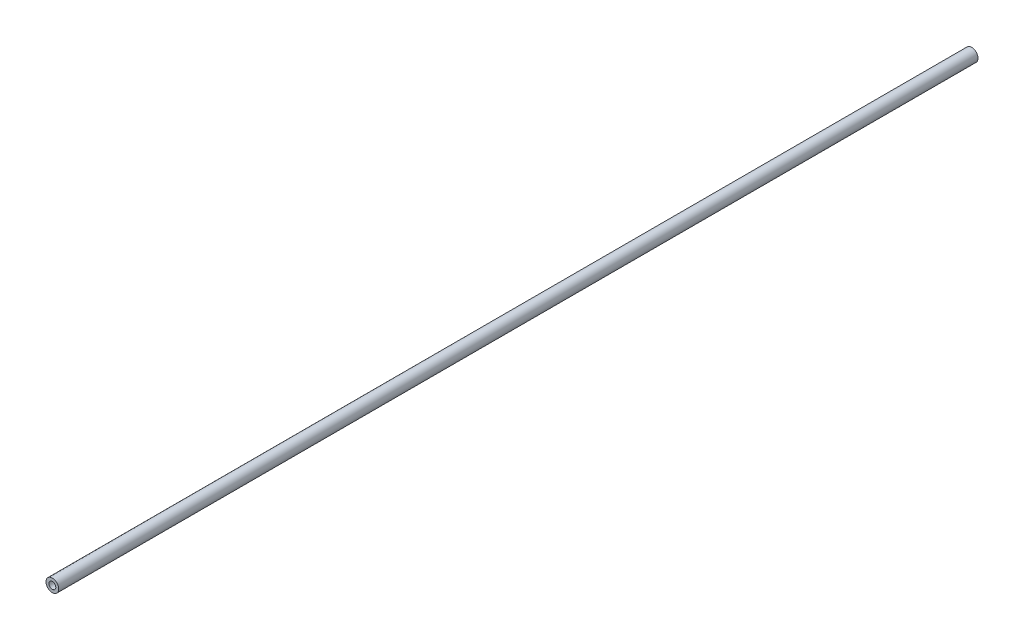
ISO-10303-21;
HEADER;
FILE_DESCRIPTION(('STEP AP214'),'2;1');
FILE_NAME('part.step','',(''),(''),'','','');
FILE_SCHEMA(('AUTOMOTIVE_DESIGN { 1 0 10303 214 1 1 1 1 }'));
ENDSEC;
DATA;
#1=APPLICATION_CONTEXT('core data for automotive mechanical design processes');
#2=APPLICATION_PROTOCOL_DEFINITION('international standard','automotive_design',2000,#1);
#3=PRODUCT_CONTEXT('',#1,'mechanical');
#4=PRODUCT('Part','Part','',(#3));
#5=PRODUCT_RELATED_PRODUCT_CATEGORY('part','',(#4));
#6=PRODUCT_DEFINITION_FORMATION('','',#4);
#7=PRODUCT_DEFINITION_CONTEXT('part definition',#1,'design');
#8=PRODUCT_DEFINITION('design','',#6,#7);
#9=PRODUCT_DEFINITION_SHAPE('','',#8);
#10=(LENGTH_UNIT() NAMED_UNIT(*) SI_UNIT(.MILLI.,.METRE.));
#11=(NAMED_UNIT(*) PLANE_ANGLE_UNIT() SI_UNIT($,.RADIAN.));
#12=(NAMED_UNIT(*) SI_UNIT($,.STERADIAN.) SOLID_ANGLE_UNIT());
#13=UNCERTAINTY_MEASURE_WITH_UNIT(LENGTH_MEASURE(1.E-05),#10,'distance_accuracy_value','');
#14=(GEOMETRIC_REPRESENTATION_CONTEXT(3) GLOBAL_UNCERTAINTY_ASSIGNED_CONTEXT((#13)) GLOBAL_UNIT_ASSIGNED_CONTEXT((#10,
#11,#12)) REPRESENTATION_CONTEXT('',''));
#15=CARTESIAN_POINT('',(0.,0.,0.));
#16=DIRECTION('',(0.,0.,1.));
#17=DIRECTION('',(1.,0.,0.));
#18=AXIS2_PLACEMENT_3D('',#15,#16,#17);
#19=CARTESIAN_POINT('',(0.,0.,322.072));
#20=DIRECTION('',(0.,0.,1.));
#21=DIRECTION('',(1.,0.,0.));
#22=AXIS2_PLACEMENT_3D('',#19,#20,#21);
#23=PLANE('',#22);
#24=CARTESIAN_POINT('',(0.,0.,322.072));
#25=DIRECTION('',(0.,0.,1.));
#26=DIRECTION('',(1.,0.,0.));
#27=AXIS2_PLACEMENT_3D('',#24,#25,#26);
#28=CIRCLE('',#27,2.2225);
#29=CARTESIAN_POINT('',(2.2225,0.,322.072));
#30=VERTEX_POINT('',#29);
#31=EDGE_CURVE('E10',#30,#30,#28,.T.);
#32=ORIENTED_EDGE('',*,*,#31,.T.);
#33=EDGE_LOOP('',(#32));
#34=FACE_BOUND('',#33,.T.);
#35=CARTESIAN_POINT('',(0.,0.,322.072));
#36=DIRECTION('',(0.,0.,1.));
#37=DIRECTION('',(1.,0.,0.));
#38=AXIS2_PLACEMENT_3D('',#35,#36,#37);
#39=CIRCLE('',#38,1.2065);
#40=CARTESIAN_POINT('',(1.2065,0.,322.072));
#41=VERTEX_POINT('',#40);
#42=EDGE_CURVE('E42',#41,#41,#39,.T.);
#43=ORIENTED_EDGE('',*,*,#42,.F.);
#44=EDGE_LOOP('',(#43));
#45=FACE_BOUND('',#44,.T.);
#46=ADVANCED_FACE('F31',(#34,#45),#23,.T.);
#47=CARTESIAN_POINT('',(0.,0.,0.));
#48=DIRECTION('',(0.,0.,1.));
#49=DIRECTION('',(1.,0.,0.));
#50=AXIS2_PLACEMENT_3D('',#47,#48,#49);
#51=PLANE('',#50);
#52=CARTESIAN_POINT('',(0.,0.,0.));
#53=DIRECTION('',(0.,0.,1.));
#54=DIRECTION('',(1.,0.,0.));
#55=AXIS2_PLACEMENT_3D('',#52,#53,#54);
#56=CIRCLE('',#55,2.2225);
#57=CARTESIAN_POINT('',(2.2225,0.,0.));
#58=VERTEX_POINT('',#57);
#59=EDGE_CURVE('E35',#58,#58,#56,.T.);
#60=ORIENTED_EDGE('',*,*,#59,.F.);
#61=EDGE_LOOP('',(#60));
#62=FACE_BOUND('',#61,.T.);
#63=CARTESIAN_POINT('',(0.,0.,0.));
#64=DIRECTION('',(0.,0.,1.));
#65=DIRECTION('',(1.,0.,0.));
#66=AXIS2_PLACEMENT_3D('',#63,#64,#65);
#67=CIRCLE('',#66,1.2065);
#68=CARTESIAN_POINT('',(1.2065,0.,0.));
#69=VERTEX_POINT('',#68);
#70=EDGE_CURVE('E44',#69,#69,#67,.T.);
#71=ORIENTED_EDGE('',*,*,#70,.T.);
#72=EDGE_LOOP('',(#71));
#73=FACE_BOUND('',#72,.T.);
#74=ADVANCED_FACE('F54',(#62,#73),#51,.F.);
#75=CARTESIAN_POINT('',(0.,0.,322.072));
#76=DIRECTION('',(0.,0.,-1.));
#77=DIRECTION('',(-1.,0.,0.));
#78=AXIS2_PLACEMENT_3D('',#75,#76,#77);
#79=CYLINDRICAL_SURFACE('',#78,2.2225);
#80=ORIENTED_EDGE('',*,*,#31,.F.);
#81=EDGE_LOOP('',(#80));
#82=FACE_BOUND('',#81,.T.);
#83=ORIENTED_EDGE('',*,*,#59,.T.);
#84=EDGE_LOOP('',(#83));
#85=FACE_BOUND('',#84,.T.);
#86=ADVANCED_FACE('F33',(#82,#85),#79,.T.);
#87=CARTESIAN_POINT('',(0.,0.,322.072));
#88=DIRECTION('',(0.,0.,-1.));
#89=DIRECTION('',(-1.,0.,0.));
#90=AXIS2_PLACEMENT_3D('',#87,#88,#89);
#91=CYLINDRICAL_SURFACE('',#90,1.2065);
#92=ORIENTED_EDGE('',*,*,#42,.T.);
#93=EDGE_LOOP('',(#92));
#94=FACE_BOUND('',#93,.T.);
#95=ORIENTED_EDGE('',*,*,#70,.F.);
#96=EDGE_LOOP('',(#95));
#97=FACE_BOUND('',#96,.T.);
#98=ADVANCED_FACE('F50',(#94,#97),#91,.F.);
#99=CLOSED_SHELL('',(#46,#74,#86,#98));
#100=MANIFOLD_SOLID_BREP('B2',#99);
#101=ADVANCED_BREP_SHAPE_REPRESENTATION('',(#18,#100),#14);
#102=SHAPE_DEFINITION_REPRESENTATION(#9,#101);
ENDSEC;
END-ISO-10303-21;
